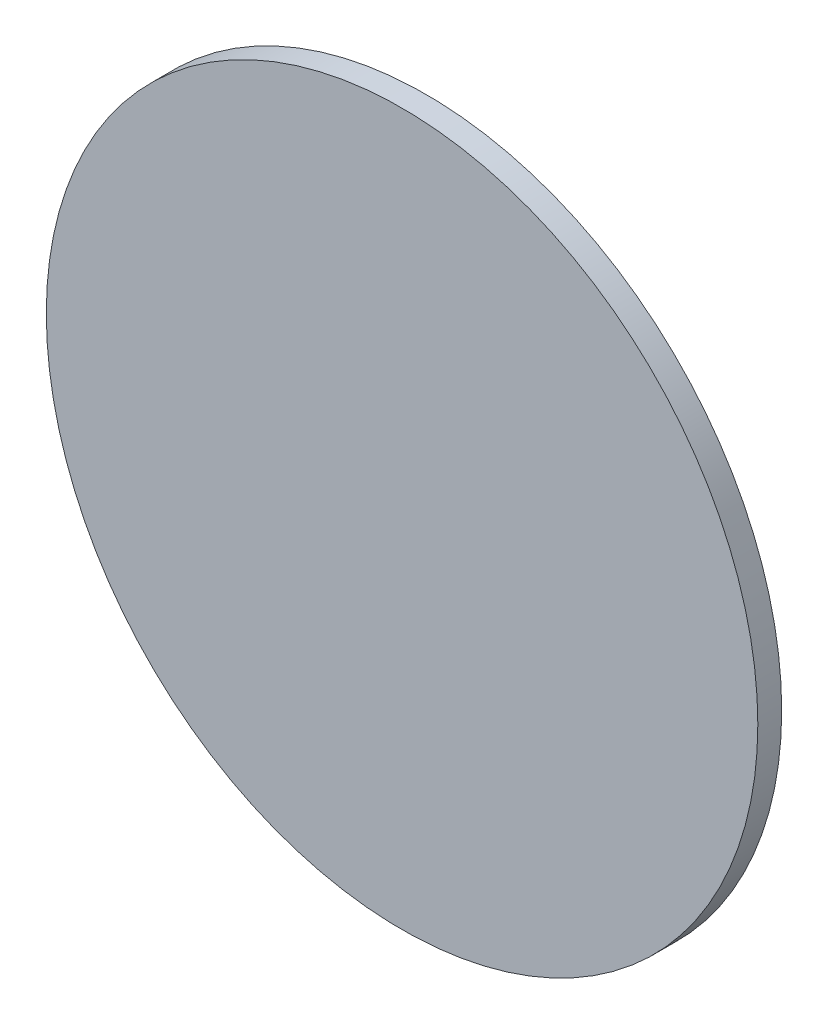
ISO-10303-21;
HEADER;
FILE_DESCRIPTION(('STEP AP214'),'2;1');
FILE_NAME('part.step','',(''),(''),'','','');
FILE_SCHEMA(('AUTOMOTIVE_DESIGN { 1 0 10303 214 1 1 1 1 }'));
ENDSEC;
DATA;
#1=APPLICATION_CONTEXT('core data for automotive mechanical design processes');
#2=APPLICATION_PROTOCOL_DEFINITION('international standard','automotive_design',2000,#1);
#3=PRODUCT_CONTEXT('',#1,'mechanical');
#4=PRODUCT('Part','Part','',(#3));
#5=PRODUCT_RELATED_PRODUCT_CATEGORY('part','',(#4));
#6=PRODUCT_DEFINITION_FORMATION('','',#4);
#7=PRODUCT_DEFINITION_CONTEXT('part definition',#1,'design');
#8=PRODUCT_DEFINITION('design','',#6,#7);
#9=PRODUCT_DEFINITION_SHAPE('','',#8);
#10=(LENGTH_UNIT() NAMED_UNIT(*) SI_UNIT(.MILLI.,.METRE.));
#11=(NAMED_UNIT(*) PLANE_ANGLE_UNIT() SI_UNIT($,.RADIAN.));
#12=(NAMED_UNIT(*) SI_UNIT($,.STERADIAN.) SOLID_ANGLE_UNIT());
#13=UNCERTAINTY_MEASURE_WITH_UNIT(LENGTH_MEASURE(1.E-05),#10,'distance_accuracy_value','');
#14=(GEOMETRIC_REPRESENTATION_CONTEXT(3) GLOBAL_UNCERTAINTY_ASSIGNED_CONTEXT((#13)) GLOBAL_UNIT_ASSIGNED_CONTEXT((#10,
#11,#12)) REPRESENTATION_CONTEXT('',''));
#15=CARTESIAN_POINT('',(0.,0.,0.));
#16=DIRECTION('',(0.,0.,1.));
#17=DIRECTION('',(1.,0.,0.));
#18=AXIS2_PLACEMENT_3D('',#15,#16,#17);
#19=CARTESIAN_POINT('',(0.,0.,5.));
#20=DIRECTION('',(0.,0.,-1.));
#21=DIRECTION('',(-1.,0.,0.));
#22=AXIS2_PLACEMENT_3D('',#19,#20,#21);
#23=CYLINDRICAL_SURFACE('',#22,74.5);
#24=CARTESIAN_POINT('',(0.,0.,5.));
#25=DIRECTION('',(0.,0.,1.));
#26=DIRECTION('',(1.,0.,0.));
#27=AXIS2_PLACEMENT_3D('',#24,#25,#26);
#28=CIRCLE('',#27,74.5);
#29=CARTESIAN_POINT('',(74.5,0.,5.));
#30=VERTEX_POINT('',#29);
#31=EDGE_CURVE('E10',#30,#30,#28,.T.);
#32=ORIENTED_EDGE('',*,*,#31,.F.);
#33=EDGE_LOOP('',(#32));
#34=FACE_BOUND('',#33,.T.);
#35=CARTESIAN_POINT('',(0.,0.,0.));
#36=DIRECTION('',(0.,0.,1.));
#37=DIRECTION('',(1.,0.,0.));
#38=AXIS2_PLACEMENT_3D('',#35,#36,#37);
#39=CIRCLE('',#38,74.5);
#40=CARTESIAN_POINT('',(74.5,0.,0.));
#41=VERTEX_POINT('',#40);
#42=EDGE_CURVE('E34',#41,#41,#39,.T.);
#43=ORIENTED_EDGE('',*,*,#42,.T.);
#44=EDGE_LOOP('',(#43));
#45=FACE_BOUND('',#44,.T.);
#46=ADVANCED_FACE('F31',(#34,#45),#23,.T.);
#47=CARTESIAN_POINT('',(0.,0.,5.));
#48=DIRECTION('',(0.,0.,1.));
#49=DIRECTION('',(1.,0.,0.));
#50=AXIS2_PLACEMENT_3D('',#47,#48,#49);
#51=PLANE('',#50);
#52=ORIENTED_EDGE('',*,*,#31,.T.);
#53=EDGE_LOOP('',(#52));
#54=FACE_BOUND('',#53,.T.);
#55=ADVANCED_FACE('F46',(#54),#51,.T.);
#56=CARTESIAN_POINT('',(0.,0.,0.));
#57=DIRECTION('',(0.,0.,1.));
#58=DIRECTION('',(1.,0.,0.));
#59=AXIS2_PLACEMENT_3D('',#56,#57,#58);
#60=PLANE('',#59);
#61=ORIENTED_EDGE('',*,*,#42,.F.);
#62=EDGE_LOOP('',(#61));
#63=FACE_BOUND('',#62,.T.);
#64=ADVANCED_FACE('F44',(#63),#60,.F.);
#65=CLOSED_SHELL('',(#46,#55,#64));
#66=MANIFOLD_SOLID_BREP('B2',#65);
#67=ADVANCED_BREP_SHAPE_REPRESENTATION('',(#18,#66),#14);
#68=SHAPE_DEFINITION_REPRESENTATION(#9,#67);
ENDSEC;
END-ISO-10303-21;
